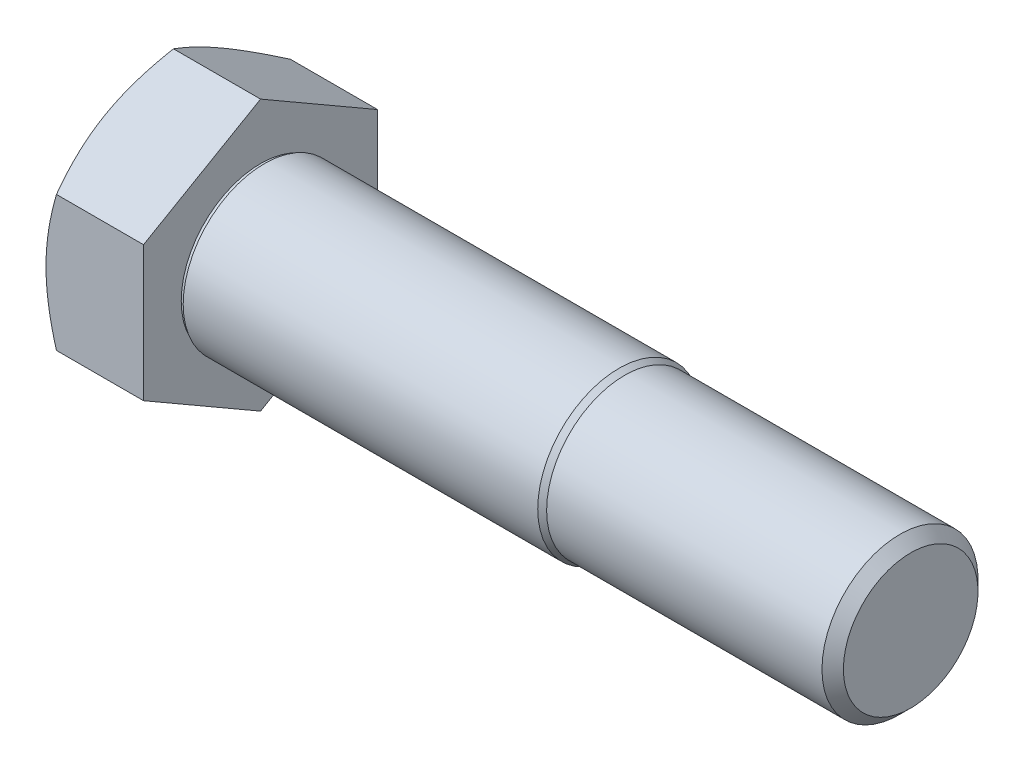
ISO-10303-21;
HEADER;
FILE_DESCRIPTION(('STEP AP214'),'2;1');
FILE_NAME('part.step','',(''),(''),'','','');
FILE_SCHEMA(('AUTOMOTIVE_DESIGN { 1 0 10303 214 1 1 1 1 }'));
ENDSEC;
DATA;
#1=APPLICATION_CONTEXT('core data for automotive mechanical design processes');
#2=APPLICATION_PROTOCOL_DEFINITION('international standard','automotive_design',2000,#1);
#3=PRODUCT_CONTEXT('',#1,'mechanical');
#4=PRODUCT('Part','Part','',(#3));
#5=PRODUCT_RELATED_PRODUCT_CATEGORY('part','',(#4));
#6=PRODUCT_DEFINITION_FORMATION('','',#4);
#7=PRODUCT_DEFINITION_CONTEXT('part definition',#1,'design');
#8=PRODUCT_DEFINITION('design','',#6,#7);
#9=PRODUCT_DEFINITION_SHAPE('','',#8);
#10=(LENGTH_UNIT() NAMED_UNIT(*) SI_UNIT(.MILLI.,.METRE.));
#11=(NAMED_UNIT(*) PLANE_ANGLE_UNIT() SI_UNIT($,.RADIAN.));
#12=(NAMED_UNIT(*) SI_UNIT($,.STERADIAN.) SOLID_ANGLE_UNIT());
#13=UNCERTAINTY_MEASURE_WITH_UNIT(LENGTH_MEASURE(1.E-05),#10,'distance_accuracy_value','');
#14=(GEOMETRIC_REPRESENTATION_CONTEXT(3) GLOBAL_UNCERTAINTY_ASSIGNED_CONTEXT((#13)) GLOBAL_UNIT_ASSIGNED_CONTEXT((#10,
#11,#12)) REPRESENTATION_CONTEXT('',''));
#15=CARTESIAN_POINT('',(0.,0.,0.));
#16=DIRECTION('',(0.,0.,1.));
#17=DIRECTION('',(1.,0.,0.));
#18=AXIS2_PLACEMENT_3D('',#15,#16,#17);
#19=CARTESIAN_POINT('',(-5.61194554994622,36.3424917997065,25.367225787412));
#20=DIRECTION('',(1.,0.,0.));
#21=DIRECTION('',(0.,0.,-1.));
#22=AXIS2_PLACEMENT_3D('',#19,#20,#21);
#23=PLANE('',#22);
#24=DIRECTION('',(0.,0.5,0.866025403784439));
#25=VECTOR('',#24,1.);
#26=CARTESIAN_POINT('',(-5.61194554994622,15.55788210888,-10.632774212588));
#27=LINE('',#26,#25);
#28=CARTESIAN_POINT('',(-5.61194554994622,15.55788210888,-10.632774212588));
#29=VERTEX_POINT('',#28);
#30=CARTESIAN_POINT('',(-5.61194554994622,25.9501869542932,7.367225787412));
#31=VERTEX_POINT('',#30);
#32=EDGE_CURVE('E156',#29,#31,#27,.T.);
#33=ORIENTED_EDGE('',*,*,#32,.T.);
#34=DIRECTION('',(0.,-0.5,0.866025403784439));
#35=VECTOR('',#34,1.);
#36=CARTESIAN_POINT('',(-5.61194554994622,25.9501869542932,7.367225787412));
#37=LINE('',#36,#35);
#38=CARTESIAN_POINT('',(-5.61194554994622,15.55788210888,25.367225787412));
#39=VERTEX_POINT('',#38);
#40=EDGE_CURVE('E154',#31,#39,#37,.T.);
#41=ORIENTED_EDGE('',*,*,#40,.T.);
#42=DIRECTION('',(0.,-1.,0.));
#43=VECTOR('',#42,1.);
#44=CARTESIAN_POINT('',(-5.61194554994622,15.55788210888,25.367225787412));
#45=LINE('',#44,#43);
#46=CARTESIAN_POINT('',(-5.61194554994622,-5.22672758194655,25.367225787412));
#47=VERTEX_POINT('',#46);
#48=EDGE_CURVE('E131',#39,#47,#45,.T.);
#49=ORIENTED_EDGE('',*,*,#48,.T.);
#50=DIRECTION('',(0.,-0.5,-0.866025403784438));
#51=VECTOR('',#50,1.);
#52=CARTESIAN_POINT('',(-5.61194554994622,-5.22672758194655,25.367225787412));
#53=LINE('',#52,#51);
#54=CARTESIAN_POINT('',(-5.61194554994622,-15.6190324273598,7.36722578741201));
#55=VERTEX_POINT('',#54);
#56=EDGE_CURVE('E151',#47,#55,#53,.T.);
#57=ORIENTED_EDGE('',*,*,#56,.T.);
#58=DIRECTION('',(0.,0.5,-0.866025403784439));
#59=VECTOR('',#58,1.);
#60=CARTESIAN_POINT('',(-5.61194554994622,-15.6190324273598,7.36722578741201));
#61=LINE('',#60,#59);
#62=CARTESIAN_POINT('',(-5.61194554994622,-5.22672758194656,-10.632774212588));
#63=VERTEX_POINT('',#62);
#64=EDGE_CURVE('E149',#55,#63,#61,.T.);
#65=ORIENTED_EDGE('',*,*,#64,.T.);
#66=DIRECTION('',(0.,1.,0.));
#67=VECTOR('',#66,1.);
#68=CARTESIAN_POINT('',(-5.61194554994622,-5.22672758194656,-10.632774212588));
#69=LINE('',#68,#67);
#70=EDGE_CURVE('E147',#63,#29,#69,.T.);
#71=ORIENTED_EDGE('',*,*,#70,.T.);
#72=EDGE_LOOP('',(#33,#41,#49,#57,#65,#71));
#73=FACE_BOUND('',#72,.T.);
#74=CARTESIAN_POINT('',(-5.61194554994622,5.16557726346671,7.367225787412));
#75=DIRECTION('',(-1.,0.,0.));
#76=DIRECTION('',(0.,0.,1.));
#77=AXIS2_PLACEMENT_3D('',#74,#75,#76);
#78=CIRCLE('',#77,12.2);
#79=CARTESIAN_POINT('',(-5.61194554994622,5.16557726346671,19.567225787412));
#80=VERTEX_POINT('',#79);
#81=EDGE_CURVE('E249',#80,#80,#78,.T.);
#82=ORIENTED_EDGE('',*,*,#81,.T.);
#83=EDGE_LOOP('',(#82));
#84=FACE_BOUND('',#83,.T.);
#85=ADVANCED_FACE('F38',(#73,#84),#23,.T.);
#86=CARTESIAN_POINT('',(-5.61194554994622,15.55788210888,-10.632774212588));
#87=DIRECTION('',(0.,-0.866025403784439,0.5));
#88=DIRECTION('',(0.,-0.5,-0.866025403784439));
#89=AXIS2_PLACEMENT_3D('',#86,#87,#88);
#90=PLANE('',#89);
#91=CARTESIAN_POINT('',(-19.0041837281373,25.9503024243471,7.367425787412));
#92=CARTESIAN_POINT('',(-19.1360521843831,25.721883843052,6.97179319921611));
#93=CARTESIAN_POINT('',(-19.2619366597344,25.4925743066896,6.57461743157644));
#94=CARTESIAN_POINT('',(-19.5000743138352,25.0321164436975,5.77708101812953));
#95=CARTESIAN_POINT('',(-19.6123230092869,24.800967538776,5.37671937069149));
#96=CARTESIAN_POINT('',(-19.8216802523623,24.336384200377,4.57203742423445));
#97=CARTESIAN_POINT('',(-19.9187529768052,24.1029457013472,4.16771008347221));
#98=CARTESIAN_POINT('',(-20.0956738061586,23.6344466473242,3.35624591860653));
#99=CARTESIAN_POINT('',(-20.1755228975255,23.3993861860226,2.94910925678158));
#100=CARTESIAN_POINT('',(-20.3146002470914,22.9336662512624,2.14245866767916));
#101=CARTESIAN_POINT('',(-20.3742888268326,22.7030413527097,1.74300462589558));
#102=CARTESIAN_POINT('',(-20.4743731742768,22.2407347994414,0.942266186962716));
#103=CARTESIAN_POINT('',(-20.5147685706211,22.0090531244713,0.54098175473183));
#104=CARTESIAN_POINT('',(-20.5752465911287,21.5453005919458,-0.262261193740945));
#105=CARTESIAN_POINT('',(-20.5953533529074,21.3132305266549,-0.664218337740617));
#106=CARTESIAN_POINT('',(-20.6148216959488,20.8488761876921,-1.46850364553937));
#107=CARTESIAN_POINT('',(-20.6141839182373,20.6165919208609,-1.87083179748978));
#108=CARTESIAN_POINT('',(-20.5936119704498,20.1823311283239,-2.6229935538991));
#109=CARTESIAN_POINT('',(-20.5761863655456,19.9803236615543,-2.97288074985222));
#110=CARTESIAN_POINT('',(-20.525976481445,19.5767905935615,-3.67182052614991));
#111=CARTESIAN_POINT('',(-20.49319242221,19.3752649854787,-4.02087311837557));
#112=CARTESIAN_POINT('',(-20.4128344923675,18.9727719875026,-4.71801144056083));
#113=CARTESIAN_POINT('',(-20.3652472473814,18.7718052688824,-5.06609600784153));
#114=CARTESIAN_POINT('',(-20.2561226733788,18.3708285197288,-5.76060811002932));
#115=CARTESIAN_POINT('',(-20.1945854034736,18.1708184851453,-6.10703565195148));
#116=CARTESIAN_POINT('',(-19.9874834742377,17.5636622331359,-7.158661128565));
#117=CARTESIAN_POINT('',(-19.8212680820131,17.1582742781367,-7.86081366339998));
#118=CARTESIAN_POINT('',(-19.4440273796474,16.3535431138373,-9.25464892640057));
#119=CARTESIAN_POINT('',(-19.2330906628185,15.9541896016968,-9.94634949960911));
#120=CARTESIAN_POINT('',(-19.0041837281373,15.5577666388261,-10.632974212588));
#121=B_SPLINE_CURVE_WITH_KNOTS('',3,(#91,#92,#93,#94,#95,#96,#97,#98,#99,#100,#101,#102,#103,
#104,#105,#106,#107,#108,#109,#110,#111,#112,#113,#114,#115,#116,#117,#118,#119,#120),
.UNSPECIFIED.,.F.,.F.,(4,2,2,2,2,2,2,2,2,2,2,2,2,2,4),(0.,1.42650335783821,2.85347447244912,
4.28376471280637,5.71397301377358,7.10888071673007,8.50381526803679,9.89708828642548,
11.2903182514067,12.5031974791544,13.7160593367767,14.9300201888636,16.1439758970578,
18.6253607678546,21.1018751738864),.UNSPECIFIED.);
#122=CARTESIAN_POINT('',(-19.0042503953595,25.9501869542932,7.367225787412));
#123=VERTEX_POINT('',#122);
#124=CARTESIAN_POINT('',(-20.6119455499462,20.7540345315866,-1.632774212588));
#125=VERTEX_POINT('',#124);
#126=EDGE_CURVE('E55',#123,#125,#121,.T.);
#127=ORIENTED_EDGE('',*,*,#126,.F.);
#128=DIRECTION('',(-1.,0.,0.));
#129=VECTOR('',#128,1.);
#130=CARTESIAN_POINT('',(-5.61194554994622,25.9501869542932,7.367225787412));
#131=LINE('',#130,#129);
#132=EDGE_CURVE('E132',#31,#123,#131,.T.);
#133=ORIENTED_EDGE('',*,*,#132,.F.);
#134=ORIENTED_EDGE('',*,*,#32,.F.);
#135=DIRECTION('',(-1.,0.,0.));
#136=VECTOR('',#135,1.);
#137=CARTESIAN_POINT('',(-5.61194554994622,15.55788210888,-10.632774212588));
#138=LINE('',#137,#136);
#139=CARTESIAN_POINT('',(-19.0042503953595,15.55788210888,-10.632774212588));
#140=VERTEX_POINT('',#139);
#141=EDGE_CURVE('E144',#29,#140,#138,.T.);
#142=ORIENTED_EDGE('',*,*,#141,.T.);
#143=EDGE_CURVE('E203',#125,#140,#121,.T.);
#144=ORIENTED_EDGE('',*,*,#143,.F.);
#145=EDGE_LOOP('',(#127,#133,#134,#142,#144));
#146=FACE_BOUND('',#145,.T.);
#147=ADVANCED_FACE('F40',(#146),#90,.F.);
#148=CARTESIAN_POINT('',(-5.61194554994622,25.9501869542932,7.367225787412));
#149=DIRECTION('',(0.,-0.866025403784439,-0.5));
#150=DIRECTION('',(0.,0.5,-0.866025403784439));
#151=AXIS2_PLACEMENT_3D('',#148,#149,#150);
#152=PLANE('',#151);
#153=CARTESIAN_POINT('',(-19.0041837281373,15.5577666388261,25.367425787412));
#154=CARTESIAN_POINT('',(-19.1360521843831,15.7861852201212,24.9717931992161));
#155=CARTESIAN_POINT('',(-19.2619366597344,16.0154947564836,24.5746174315764));
#156=CARTESIAN_POINT('',(-19.5000743138352,16.4759526194757,23.7770810181295));
#157=CARTESIAN_POINT('',(-19.6123230092869,16.7071015243972,23.3767193706915));
#158=CARTESIAN_POINT('',(-19.8216802523623,17.1716848627962,22.5720374242345));
#159=CARTESIAN_POINT('',(-19.9187529768052,17.405123361826,22.1677100834722));
#160=CARTESIAN_POINT('',(-20.0956738061586,17.873622415849,21.3562459186065));
#161=CARTESIAN_POINT('',(-20.1755228975255,18.1086828771506,20.9491092567816));
#162=CARTESIAN_POINT('',(-20.3146002470914,18.5744028119108,20.1424586676792));
#163=CARTESIAN_POINT('',(-20.3742888268326,18.8050277104635,19.7430046258956));
#164=CARTESIAN_POINT('',(-20.4743731742768,19.2673342637318,18.9422661869627));
#165=CARTESIAN_POINT('',(-20.5147685706211,19.499015938702,18.5409817547318));
#166=CARTESIAN_POINT('',(-20.5752465911287,19.9627684712274,17.7377388062591));
#167=CARTESIAN_POINT('',(-20.5953533529074,20.1948385365183,17.3357816622594));
#168=CARTESIAN_POINT('',(-20.6148216959488,20.6591928754811,16.5314963544606));
#169=CARTESIAN_POINT('',(-20.6141839182373,20.8914771423123,16.1291682025102));
#170=CARTESIAN_POINT('',(-20.5936119704498,21.3257379348493,15.3770064461009));
#171=CARTESIAN_POINT('',(-20.5761863655456,21.5277454016189,15.0271192501478));
#172=CARTESIAN_POINT('',(-20.525976481445,21.9312784696117,14.3281794738501));
#173=CARTESIAN_POINT('',(-20.49319242221,22.1328040776945,13.9791268816244));
#174=CARTESIAN_POINT('',(-20.4128344923675,22.5352970756706,13.2819885594392));
#175=CARTESIAN_POINT('',(-20.3652472473814,22.7362637942908,12.9339039921585));
#176=CARTESIAN_POINT('',(-20.2561226733788,23.1372405434444,12.2393918899707));
#177=CARTESIAN_POINT('',(-20.1945854034736,23.3372505780279,11.8929643480485));
#178=CARTESIAN_POINT('',(-19.9874834742377,23.9444068300374,10.841338871435));
#179=CARTESIAN_POINT('',(-19.8212680820131,24.3497947850365,10.1391863366));
#180=CARTESIAN_POINT('',(-19.4440273796474,25.1545259493359,8.74535107359942));
#181=CARTESIAN_POINT('',(-19.2330906628185,25.5538794614765,8.05365050039088));
#182=CARTESIAN_POINT('',(-19.0041837281373,25.9503024243471,7.367025787412));
#183=B_SPLINE_CURVE_WITH_KNOTS('',3,(#153,#154,#155,#156,#157,#158,#159,#160,#161,#162,#163,
#164,#165,#166,#167,#168,#169,#170,#171,#172,#173,#174,#175,#176,#177,#178,#179,#180,#181,#182),
.UNSPECIFIED.,.F.,.F.,(4,2,2,2,2,2,2,2,2,2,2,2,2,2,4),(0.,1.42650335783821,2.85347447244912,
4.28376471280637,5.71397301377358,7.10888071673008,8.5038152680368,9.89708828642549,
11.2903182514067,12.5031974791544,13.7160593367767,14.9300201888636,16.1439758970578,
18.6253607678546,21.1018751738864),.UNSPECIFIED.);
#184=CARTESIAN_POINT('',(-19.0042503953595,15.55788210888,25.367225787412));
#185=VERTEX_POINT('',#184);
#186=CARTESIAN_POINT('',(-20.6119455499462,20.7540345315866,16.367225787412));
#187=VERTEX_POINT('',#186);
#188=EDGE_CURVE('E62',#185,#187,#183,.T.);
#189=ORIENTED_EDGE('',*,*,#188,.F.);
#190=DIRECTION('',(-1.,0.,0.));
#191=VECTOR('',#190,1.);
#192=CARTESIAN_POINT('',(-5.61194554994622,15.55788210888,25.367225787412));
#193=LINE('',#192,#191);
#194=EDGE_CURVE('E124',#39,#185,#193,.T.);
#195=ORIENTED_EDGE('',*,*,#194,.F.);
#196=ORIENTED_EDGE('',*,*,#40,.F.);
#197=ORIENTED_EDGE('',*,*,#132,.T.);
#198=EDGE_CURVE('E127',#187,#123,#183,.T.);
#199=ORIENTED_EDGE('',*,*,#198,.F.);
#200=EDGE_LOOP('',(#189,#195,#196,#197,#199));
#201=FACE_BOUND('',#200,.T.);
#202=ADVANCED_FACE('F123',(#201),#152,.F.);
#203=CARTESIAN_POINT('',(-5.61194554994622,15.55788210888,25.367225787412));
#204=DIRECTION('',(0.,0.,-1.));
#205=DIRECTION('',(0.,1.,0.));
#206=AXIS2_PLACEMENT_3D('',#203,#204,#205);
#207=PLANE('',#206);
#208=CARTESIAN_POINT('',(-11.9984648543637,-22.3963466913481,25.367225787412));
#209=CARTESIAN_POINT('',(-12.18946784507,-22.0012104680391,25.367225787412));
#210=CARTESIAN_POINT('',(-12.3794823110363,-21.6055966426515,25.367225787412));
#211=CARTESIAN_POINT('',(-12.7573072909133,-20.8133128869273,25.367225787412));
#212=CARTESIAN_POINT('',(-12.9451177806072,-20.4166429450448,25.367225787412));
#213=CARTESIAN_POINT('',(-13.5049573359624,-19.2247814473515,25.367225787412));
#214=CARTESIAN_POINT('',(-13.8733322306512,-18.4278666425716,25.367225787412));
#215=CARTESIAN_POINT('',(-14.6000672287883,-16.8239698784672,25.367225787412));
#216=CARTESIAN_POINT('',(-14.9583579580317,-16.0169564063326,25.367225787412));
#217=CARTESIAN_POINT('',(-15.6595561007202,-14.3962973475724,25.367225787412));
#218=CARTESIAN_POINT('',(-16.0024643153907,-13.5826521089887,25.367225787412));
#219=CARTESIAN_POINT('',(-16.672868080097,-11.9373350467016,25.367225787412));
#220=CARTESIAN_POINT('',(-17.0001227257272,-11.1055645469376,25.367225787412));
#221=CARTESIAN_POINT('',(-17.6290026257973,-9.4322070227103,25.367225787412));
#222=CARTESIAN_POINT('',(-17.9306250316413,-8.59061891897299,25.367225787412));
#223=CARTESIAN_POINT('',(-18.500131872749,-6.89804353272565,25.367225787412));
#224=CARTESIAN_POINT('',(-18.7680880383487,-6.04708058494092,25.367225787412));
#225=CARTESIAN_POINT('',(-19.2615733398929,-4.33297487608337,25.367225787412));
#226=CARTESIAN_POINT('',(-19.4871158790999,-3.46983605575098,25.367225787412));
#227=CARTESIAN_POINT('',(-19.7853630006805,-2.16583189823723,25.367225787412));
#228=CARTESIAN_POINT('',(-19.878116190292,-1.72952194689036,25.367225787412));
#229=CARTESIAN_POINT('',(-20.0488023742977,-0.853998157344695,25.367225787412));
#230=CARTESIAN_POINT('',(-20.1267357015211,-0.414784384590179,25.367225787412));
#231=CARTESIAN_POINT('',(-20.2664005139497,0.466252271205412,25.367225787412));
#232=CARTESIAN_POINT('',(-20.3281310040866,0.908075312787082,25.367225787412));
#233=CARTESIAN_POINT('',(-20.4341502679296,1.79382423671469,25.367225787412));
#234=CARTESIAN_POINT('',(-20.4784390209059,2.23775012155924,25.367225787412));
#235=CARTESIAN_POINT('',(-20.5483825042872,3.12423922342469,25.367225787412));
#236=CARTESIAN_POINT('',(-20.5741538270909,3.56679318083471,25.367225787412));
#237=CARTESIAN_POINT('',(-20.6069269655557,4.4525933368334,25.367225787412));
#238=CARTESIAN_POINT('',(-20.6139290648137,4.89583952486142,25.367225787412));
#239=CARTESIAN_POINT('',(-20.6089976903522,5.78210599161337,25.367225787412));
#240=CARTESIAN_POINT('',(-20.597069454749,6.22512629891102,25.367225787412));
#241=CARTESIAN_POINT('',(-20.5545740093107,7.11027399758292,25.367225787412));
#242=CARTESIAN_POINT('',(-20.5240059789769,7.55240134879082,25.367225787412));
#243=CARTESIAN_POINT('',(-20.4279958506362,8.62365837003654,25.367225787412));
#244=CARTESIAN_POINT('',(-20.3532333736594,9.25196899728368,25.367225787412));
#245=CARTESIAN_POINT('',(-20.1702270968932,10.5036681578543,25.367225787412));
#246=CARTESIAN_POINT('',(-20.0619783299656,11.1270559468781,25.367225787412));
#247=CARTESIAN_POINT('',(-19.6924320192404,12.9909226069994,25.367225787412));
#248=CARTESIAN_POINT('',(-19.3865804764281,14.2226699754074,25.367225787412));
#249=CARTESIAN_POINT('',(-18.8591911048339,16.0651582554042,25.367225787412));
#250=CARTESIAN_POINT('',(-18.6693785564117,16.685525725334,25.367225787412));
#251=CARTESIAN_POINT('',(-18.2708283555597,17.9202672950059,25.367225787412));
#252=CARTESIAN_POINT('',(-18.06208899474,18.5346408481646,25.367225787412));
#253=CARTESIAN_POINT('',(-17.6301328805666,19.7543321687252,25.367225787412));
#254=CARTESIAN_POINT('',(-17.4070044097444,20.3596814665342,25.367225787412));
#255=CARTESIAN_POINT('',(-17.062651181119,21.2638928885656,25.367225787412));
#256=CARTESIAN_POINT('',(-16.9462763931673,21.5646126848273,25.367225787412));
#257=CARTESIAN_POINT('',(-16.7105679897717,22.1648840643901,25.367225787412));
#258=CARTESIAN_POINT('',(-16.5912344329859,22.4644356707148,25.367225787412));
#259=CARTESIAN_POINT('',(-16.4705550205082,22.7634437178675,25.367225787412));
#260=B_SPLINE_CURVE_WITH_KNOTS('',3,(#208,#209,#210,#211,#212,#213,#214,#215,#216,#217,#218,
#219,#220,#221,#222,#223,#224,#225,#226,#227,#228,#229,#230,#231,#232,#233,#234,#235,#236,#237,
#238,#239,#240,#241,#242,#243,#244,#245,#246,#247,#248,#249,#250,#251,#252,#253,#254,#255,#256,
#257,#258,#259),.UNSPECIFIED.,.F.,.F.,(4,2,2,2,2,2,2,2,2,2,2,2,2,2,2,2,2,2,2,2,2,2,2,2,2,4),(0.,
1.3166344390565,2.6332833315075,5.26700924472548,7.91580691121445,10.5644664498451,
13.2456434009398,15.9271179315146,18.6027786855858,21.2775924696093,22.6155612790714,
23.9535000364353,25.2915209416894,26.6295434371915,27.9590656257616,29.2885677255707,
30.6177020097832,31.9468948049265,33.8440459909246,35.7414787230295,39.5436531019888,
41.4897689730644,43.4360606814942,45.3713764468859,46.3387197810933,47.3060439528869),.UNSPECIFIED.);
#261=CARTESIAN_POINT('',(-19.0042503953595,-5.22672758194655,25.367225787412));
#262=VERTEX_POINT('',#261);
#263=CARTESIAN_POINT('',(-20.6119455499462,5.16557726346671,25.367225787412));
#264=VERTEX_POINT('',#263);
#265=EDGE_CURVE('E117',#262,#264,#260,.T.);
#266=ORIENTED_EDGE('',*,*,#265,.F.);
#267=DIRECTION('',(-1.,0.,0.));
#268=VECTOR('',#267,1.);
#269=CARTESIAN_POINT('',(-5.61194554994622,-5.22672758194655,25.367225787412));
#270=LINE('',#269,#268);
#271=EDGE_CURVE('E133',#47,#262,#270,.T.);
#272=ORIENTED_EDGE('',*,*,#271,.F.);
#273=ORIENTED_EDGE('',*,*,#48,.F.);
#274=ORIENTED_EDGE('',*,*,#194,.T.);
#275=EDGE_CURVE('E109',#264,#185,#260,.T.);
#276=ORIENTED_EDGE('',*,*,#275,.F.);
#277=EDGE_LOOP('',(#266,#272,#273,#274,#276));
#278=FACE_BOUND('',#277,.T.);
#279=ADVANCED_FACE('F129',(#278),#207,.F.);
#280=CARTESIAN_POINT('',(-5.61194554994622,-5.22672758194655,25.367225787412));
#281=DIRECTION('',(0.,0.866025403784438,-0.5));
#282=DIRECTION('',(0.,0.5,0.866025403784439));
#283=AXIS2_PLACEMENT_3D('',#280,#281,#282);
#284=PLANE('',#283);
#285=CARTESIAN_POINT('',(-19.0041837281373,-15.6191478974137,7.36702578741201));
#286=CARTESIAN_POINT('',(-19.1360521843831,-15.3907293161186,7.76265837560789));
#287=CARTESIAN_POINT('',(-19.2619366597344,-15.1614197797562,8.15983414324756));
#288=CARTESIAN_POINT('',(-19.5000743138352,-14.7009619167641,8.95737055669447));
#289=CARTESIAN_POINT('',(-19.6123230092869,-14.4698130118426,9.35773220413252));
#290=CARTESIAN_POINT('',(-19.8216802523623,-14.0052296734436,10.1624141505895));
#291=CARTESIAN_POINT('',(-19.9187529768052,-13.7717911744137,10.5667414913518));
#292=CARTESIAN_POINT('',(-20.0956738061586,-13.3032921203908,11.3782056562175));
#293=CARTESIAN_POINT('',(-20.1755228975255,-13.0682316590892,11.7853423180424));
#294=CARTESIAN_POINT('',(-20.3146002470914,-12.602511724329,12.5919929071448));
#295=CARTESIAN_POINT('',(-20.3742888268326,-12.3718868257763,12.9914469489284));
#296=CARTESIAN_POINT('',(-20.4743731742768,-11.909580272508,13.7921853878613));
#297=CARTESIAN_POINT('',(-20.5147685706211,-11.6778985975378,14.1934698200922));
#298=CARTESIAN_POINT('',(-20.5752465911287,-11.2141460650124,14.9967127685649));
#299=CARTESIAN_POINT('',(-20.5953533529074,-10.9820759997215,15.3986699125646));
#300=CARTESIAN_POINT('',(-20.6148216959488,-10.5177216607586,16.2029552203634));
#301=CARTESIAN_POINT('',(-20.6141839182373,-10.2854373939275,16.6052833723138));
#302=CARTESIAN_POINT('',(-20.5936119704498,-9.85117660139045,17.3574451287231));
#303=CARTESIAN_POINT('',(-20.5761863655456,-9.64916913462091,17.7073323246762));
#304=CARTESIAN_POINT('',(-20.525976481445,-9.2456360666281,18.4062721009739));
#305=CARTESIAN_POINT('',(-20.49319242221,-9.04411045854528,18.7553246931996));
#306=CARTESIAN_POINT('',(-20.4128344923675,-8.64161746056921,19.4524630153848));
#307=CARTESIAN_POINT('',(-20.3652472473814,-8.44065074194895,19.8005475826655));
#308=CARTESIAN_POINT('',(-20.2561226733788,-8.03967399279537,20.4950596848533));
#309=CARTESIAN_POINT('',(-20.1945854034736,-7.83966395821191,20.8414872267755));
#310=CARTESIAN_POINT('',(-19.9874834742377,-7.23250770620242,21.893112703389));
#311=CARTESIAN_POINT('',(-19.8212680820131,-6.82711975120327,22.595265238224));
#312=CARTESIAN_POINT('',(-19.4440273796474,-6.02238858690389,23.9891005012246));
#313=CARTESIAN_POINT('',(-19.2330906628185,-5.62303507476332,24.6808010744331));
#314=CARTESIAN_POINT('',(-19.0041837281373,-5.22661211189271,25.367425787412));
#315=B_SPLINE_CURVE_WITH_KNOTS('',3,(#285,#286,#287,#288,#289,#290,#291,#292,#293,#294,#295,
#296,#297,#298,#299,#300,#301,#302,#303,#304,#305,#306,#307,#308,#309,#310,#311,#312,#313,#314),
.UNSPECIFIED.,.F.,.F.,(4,2,2,2,2,2,2,2,2,2,2,2,2,2,4),(0.,1.42650335783821,2.85347447244912,
4.28376471280637,5.71397301377358,7.10888071673007,8.50381526803679,9.89708828642549,
11.2903182514067,12.5031974791544,13.7160593367767,14.9300201888636,16.1439758970578,
18.6253607678546,21.1018751738864),.UNSPECIFIED.);
#316=CARTESIAN_POINT('',(-19.0042503953595,-15.6190324273598,7.36722578741201));
#317=VERTEX_POINT('',#316);
#318=CARTESIAN_POINT('',(-20.6119455499462,-10.4228800046532,16.367225787412));
#319=VERTEX_POINT('',#318);
#320=EDGE_CURVE('E208',#317,#319,#315,.T.);
#321=ORIENTED_EDGE('',*,*,#320,.F.);
#322=DIRECTION('',(-1.,0.,0.));
#323=VECTOR('',#322,1.);
#324=CARTESIAN_POINT('',(-5.61194554994622,-15.6190324273598,7.36722578741201));
#325=LINE('',#324,#323);
#326=EDGE_CURVE('E136',#55,#317,#325,.T.);
#327=ORIENTED_EDGE('',*,*,#326,.F.);
#328=ORIENTED_EDGE('',*,*,#56,.F.);
#329=ORIENTED_EDGE('',*,*,#271,.T.);
#330=EDGE_CURVE('E118',#319,#262,#315,.T.);
#331=ORIENTED_EDGE('',*,*,#330,.F.);
#332=EDGE_LOOP('',(#321,#327,#328,#329,#331));
#333=FACE_BOUND('',#332,.T.);
#334=ADVANCED_FACE('F214',(#333),#284,.F.);
#335=CARTESIAN_POINT('',(-5.61194554994622,-15.6190324273598,7.36722578741201));
#336=DIRECTION('',(0.,0.866025403784439,0.5));
#337=DIRECTION('',(0.,-0.5,0.866025403784439));
#338=AXIS2_PLACEMENT_3D('',#335,#336,#337);
#339=PLANE('',#338);
#340=CARTESIAN_POINT('',(-19.0041837281373,-5.22661211189272,-10.632974212588));
#341=CARTESIAN_POINT('',(-19.1360521843831,-5.45503069318781,-10.2373416243921));
#342=CARTESIAN_POINT('',(-19.2619366597344,-5.68434022955017,-9.84016585675244));
#343=CARTESIAN_POINT('',(-19.5000743138352,-6.14479809254227,-9.04262944330553));
#344=CARTESIAN_POINT('',(-19.6123230092869,-6.37594699746383,-8.64226779586749));
#345=CARTESIAN_POINT('',(-19.8216802523623,-6.84053033586283,-7.83758584941045));
#346=CARTESIAN_POINT('',(-19.9187529768052,-7.07396883489263,-7.43325850864821));
#347=CARTESIAN_POINT('',(-20.0956738061586,-7.54246788891557,-6.62179434378253));
#348=CARTESIAN_POINT('',(-20.1755228975255,-7.77752835021717,-6.21465768195757));
#349=CARTESIAN_POINT('',(-20.3146002470914,-8.24324828497742,-5.40800709285516));
#350=CARTESIAN_POINT('',(-20.3742888268326,-8.47387318353005,-5.00855305107157));
#351=CARTESIAN_POINT('',(-20.4743731742768,-8.93617973679842,-4.20781461213871));
#352=CARTESIAN_POINT('',(-20.5147685706211,-9.16786141176853,-3.80653017990782));
#353=CARTESIAN_POINT('',(-20.5752465911287,-9.63161394429396,-3.00328723143505));
#354=CARTESIAN_POINT('',(-20.5953533529074,-9.86368400958486,-2.60133008743537));
#355=CARTESIAN_POINT('',(-20.6148216959488,-10.3280383485477,-1.79704477963663));
#356=CARTESIAN_POINT('',(-20.6141839182373,-10.5603226153789,-1.39471662768621));
#357=CARTESIAN_POINT('',(-20.5936119704498,-10.9945834079159,-0.642554871276892));
#358=CARTESIAN_POINT('',(-20.5761863655456,-11.1965908746855,-0.292667675323773));
#359=CARTESIAN_POINT('',(-20.525976481445,-11.6001239426783,0.406272100973913));
#360=CARTESIAN_POINT('',(-20.49319242221,-11.8016495507611,0.75532469319958));
#361=CARTESIAN_POINT('',(-20.4128344923675,-12.2041425487372,1.45246301538484));
#362=CARTESIAN_POINT('',(-20.3652472473814,-12.4051092673574,1.80054758266554));
#363=CARTESIAN_POINT('',(-20.2561226733788,-12.806086016511,2.49505968485333));
#364=CARTESIAN_POINT('',(-20.1945854034736,-13.0060960510945,2.84148722677549));
#365=CARTESIAN_POINT('',(-19.9874834742377,-13.6132523031039,3.89311270338901));
#366=CARTESIAN_POINT('',(-19.8212680820131,-14.0186402581031,4.59526523822399));
#367=CARTESIAN_POINT('',(-19.4440273796474,-14.8233714224025,5.98910050122458));
#368=CARTESIAN_POINT('',(-19.2330906628185,-15.222724934543,6.68080107443312));
#369=CARTESIAN_POINT('',(-19.0041837281373,-15.6191478974137,7.36742578741201));
#370=B_SPLINE_CURVE_WITH_KNOTS('',3,(#340,#341,#342,#343,#344,#345,#346,#347,#348,#349,#350,
#351,#352,#353,#354,#355,#356,#357,#358,#359,#360,#361,#362,#363,#364,#365,#366,#367,#368,#369),
.UNSPECIFIED.,.F.,.F.,(4,2,2,2,2,2,2,2,2,2,2,2,2,2,4),(0.,1.42650335783821,2.85347447244912,
4.28376471280637,5.71397301377358,7.10888071673007,8.5038152680368,9.89708828642549,
11.2903182514067,12.5031974791544,13.7160593367767,14.9300201888636,16.1439758970578,
18.6253607678546,21.1018751738864),.UNSPECIFIED.);
#371=CARTESIAN_POINT('',(-19.0042503953595,-5.22672758194656,-10.632774212588));
#372=VERTEX_POINT('',#371);
#373=CARTESIAN_POINT('',(-20.6119455499462,-10.4228800046532,-1.63277421258799));
#374=VERTEX_POINT('',#373);
#375=EDGE_CURVE('E195',#372,#374,#370,.T.);
#376=ORIENTED_EDGE('',*,*,#375,.F.);
#377=DIRECTION('',(-1.,0.,0.));
#378=VECTOR('',#377,1.);
#379=CARTESIAN_POINT('',(-5.61194554994622,-5.22672758194656,-10.632774212588));
#380=LINE('',#379,#378);
#381=EDGE_CURVE('E141',#63,#372,#380,.T.);
#382=ORIENTED_EDGE('',*,*,#381,.F.);
#383=ORIENTED_EDGE('',*,*,#64,.F.);
#384=ORIENTED_EDGE('',*,*,#326,.T.);
#385=EDGE_CURVE('E213',#374,#317,#370,.T.);
#386=ORIENTED_EDGE('',*,*,#385,.F.);
#387=EDGE_LOOP('',(#376,#382,#383,#384,#386));
#388=FACE_BOUND('',#387,.T.);
#389=ADVANCED_FACE('F217',(#388),#339,.F.);
#390=CARTESIAN_POINT('',(-5.61194554994622,-5.22672758194656,-10.632774212588));
#391=DIRECTION('',(0.,0.,1.));
#392=DIRECTION('',(0.,-1.,0.));
#393=AXIS2_PLACEMENT_3D('',#390,#391,#392);
#394=PLANE('',#393);
#395=CARTESIAN_POINT('',(-11.9984648543637,-22.3963466913481,-10.632774212588));
#396=CARTESIAN_POINT('',(-12.18946784507,-22.0012104680391,-10.632774212588));
#397=CARTESIAN_POINT('',(-12.3794823110363,-21.6055966426515,-10.632774212588));
#398=CARTESIAN_POINT('',(-12.7573072909133,-20.8133128869273,-10.632774212588));
#399=CARTESIAN_POINT('',(-12.9451177806072,-20.4166429450448,-10.632774212588));
#400=CARTESIAN_POINT('',(-13.5049573359624,-19.2247814473515,-10.632774212588));
#401=CARTESIAN_POINT('',(-13.8733322306512,-18.4278666425716,-10.632774212588));
#402=CARTESIAN_POINT('',(-14.6000672287883,-16.8239698784672,-10.632774212588));
#403=CARTESIAN_POINT('',(-14.9583579580317,-16.0169564063326,-10.632774212588));
#404=CARTESIAN_POINT('',(-15.6595561007202,-14.3962973475724,-10.632774212588));
#405=CARTESIAN_POINT('',(-16.0024643153907,-13.5826521089887,-10.632774212588));
#406=CARTESIAN_POINT('',(-16.672868080097,-11.9373350467016,-10.632774212588));
#407=CARTESIAN_POINT('',(-17.0001227257272,-11.1055645469376,-10.632774212588));
#408=CARTESIAN_POINT('',(-17.6290026257973,-9.4322070227103,-10.632774212588));
#409=CARTESIAN_POINT('',(-17.9306250316413,-8.590618918973,-10.632774212588));
#410=CARTESIAN_POINT('',(-18.500131872749,-6.89804353272566,-10.632774212588));
#411=CARTESIAN_POINT('',(-18.7680880383487,-6.04708058494093,-10.632774212588));
#412=CARTESIAN_POINT('',(-19.261573339893,-4.33297487608338,-10.632774212588));
#413=CARTESIAN_POINT('',(-19.4871158790999,-3.46983605575099,-10.632774212588));
#414=CARTESIAN_POINT('',(-19.7853630006805,-2.16583189823724,-10.632774212588));
#415=CARTESIAN_POINT('',(-19.878116190292,-1.72952194689037,-10.632774212588));
#416=CARTESIAN_POINT('',(-20.0488023742977,-0.853998157344704,-10.632774212588));
#417=CARTESIAN_POINT('',(-20.1267357015211,-0.414784384590187,-10.632774212588));
#418=CARTESIAN_POINT('',(-20.2664005139497,0.466252271205404,-10.632774212588));
#419=CARTESIAN_POINT('',(-20.3281310040866,0.908075312787073,-10.632774212588));
#420=CARTESIAN_POINT('',(-20.4341502679296,1.79382423671468,-10.632774212588));
#421=CARTESIAN_POINT('',(-20.4784390209059,2.23775012155923,-10.632774212588));
#422=CARTESIAN_POINT('',(-20.5483825042872,3.12423922342468,-10.632774212588));
#423=CARTESIAN_POINT('',(-20.5741538270909,3.5667931808347,-10.632774212588));
#424=CARTESIAN_POINT('',(-20.6069269655558,4.45259333683338,-10.632774212588));
#425=CARTESIAN_POINT('',(-20.6139290648137,4.89583952486141,-10.632774212588));
#426=CARTESIAN_POINT('',(-20.6089976903522,5.78210599161335,-10.632774212588));
#427=CARTESIAN_POINT('',(-20.597069454749,6.22512629891101,-10.632774212588));
#428=CARTESIAN_POINT('',(-20.5545740093107,7.1102739975829,-10.632774212588));
#429=CARTESIAN_POINT('',(-20.5240059789769,7.55240134879081,-10.632774212588));
#430=CARTESIAN_POINT('',(-20.4279958506362,8.62365837003652,-10.632774212588));
#431=CARTESIAN_POINT('',(-20.3532333736594,9.25196899728366,-10.632774212588));
#432=CARTESIAN_POINT('',(-20.1702270968932,10.5036681578543,-10.632774212588));
#433=CARTESIAN_POINT('',(-20.0619783299656,11.1270559468781,-10.632774212588));
#434=CARTESIAN_POINT('',(-19.6924320192404,12.9909226069994,-10.632774212588));
#435=CARTESIAN_POINT('',(-19.3865804764281,14.2226699754073,-10.632774212588));
#436=CARTESIAN_POINT('',(-18.8591911048339,16.0651582554042,-10.632774212588));
#437=CARTESIAN_POINT('',(-18.6693785564118,16.685525725334,-10.632774212588));
#438=CARTESIAN_POINT('',(-18.2708283555597,17.9202672950058,-10.632774212588));
#439=CARTESIAN_POINT('',(-18.06208899474,18.5346408481645,-10.632774212588));
#440=CARTESIAN_POINT('',(-17.6301328805666,19.7543321687252,-10.632774212588));
#441=CARTESIAN_POINT('',(-17.4070044097444,20.3596814665341,-10.632774212588));
#442=CARTESIAN_POINT('',(-17.062651181119,21.2638928885656,-10.632774212588));
#443=CARTESIAN_POINT('',(-16.9462763931673,21.5646126848273,-10.632774212588));
#444=CARTESIAN_POINT('',(-16.7105679897717,22.1648840643901,-10.632774212588));
#445=CARTESIAN_POINT('',(-16.5912344329859,22.4644356707147,-10.632774212588));
#446=CARTESIAN_POINT('',(-16.4705550205082,22.7634437178675,-10.632774212588));
#447=B_SPLINE_CURVE_WITH_KNOTS('',3,(#395,#396,#397,#398,#399,#400,#401,#402,#403,#404,#405,
#406,#407,#408,#409,#410,#411,#412,#413,#414,#415,#416,#417,#418,#419,#420,#421,#422,#423,#424,
#425,#426,#427,#428,#429,#430,#431,#432,#433,#434,#435,#436,#437,#438,#439,#440,#441,#442,#443,
#444,#445,#446),.UNSPECIFIED.,.F.,.F.,(4,2,2,2,2,2,2,2,2,2,2,2,2,2,2,2,2,2,2,2,2,2,2,2,2,4),(0.,
1.3166344390565,2.6332833315075,5.26700924472548,7.91580691121445,10.5644664498451,
13.2456434009398,15.9271179315146,18.6027786855858,21.2775924696093,22.6155612790714,
23.9535000364353,25.2915209416894,26.6295434371915,27.9590656257616,29.2885677255707,
30.6177020097832,31.9468948049265,33.8440459909246,35.7414787230295,39.5436531019888,
41.4897689730643,43.4360606814942,45.3713764468858,46.3387197810933,47.3060439528869),.UNSPECIFIED.);
#448=CARTESIAN_POINT('',(-20.6119455499462,5.16557726346672,-10.632774212588));
#449=VERTEX_POINT('',#448);
#450=EDGE_CURVE('E271',#140,#449,#447,.F.);
#451=ORIENTED_EDGE('',*,*,#450,.F.);
#452=ORIENTED_EDGE('',*,*,#141,.F.);
#453=ORIENTED_EDGE('',*,*,#70,.F.);
#454=ORIENTED_EDGE('',*,*,#381,.T.);
#455=EDGE_CURVE('E185',#449,#372,#447,.F.);
#456=ORIENTED_EDGE('',*,*,#455,.F.);
#457=EDGE_LOOP('',(#451,#452,#453,#454,#456));
#458=FACE_BOUND('',#457,.T.);
#459=ADVANCED_FACE('F221',(#458),#394,.F.);
#460=CARTESIAN_POINT('',(-20.6119455499462,5.16557726346671,7.367225787412));
#461=DIRECTION('',(1.,0.,0.));
#462=DIRECTION('',(0.,0.,-1.));
#463=AXIS2_PLACEMENT_3D('',#460,#461,#462);
#464=CONICAL_SURFACE('',#463,18.,1.0471975511966);
#465=ORIENTED_EDGE('',*,*,#375,.T.);
#466=CARTESIAN_POINT('',(-20.6119455499462,5.16557726346671,7.367225787412));
#467=DIRECTION('',(1.,0.,0.));
#468=DIRECTION('',(0.,0.,-1.));
#469=AXIS2_PLACEMENT_3D('',#466,#467,#468);
#470=CIRCLE('',#469,18.);
#471=EDGE_CURVE('E43',#374,#449,#470,.T.);
#472=ORIENTED_EDGE('',*,*,#471,.T.);
#473=ORIENTED_EDGE('',*,*,#455,.T.);
#474=EDGE_LOOP('',(#465,#472,#473));
#475=FACE_BOUND('',#474,.T.);
#476=ADVANCED_FACE('F178',(#475),#464,.T.);
#477=ORIENTED_EDGE('',*,*,#320,.T.);
#478=EDGE_CURVE('E285',#319,#374,#470,.T.);
#479=ORIENTED_EDGE('',*,*,#478,.T.);
#480=ORIENTED_EDGE('',*,*,#385,.T.);
#481=EDGE_LOOP('',(#477,#479,#480));
#482=FACE_BOUND('',#481,.T.);
#483=ADVANCED_FACE('F176',(#482),#464,.T.);
#484=ORIENTED_EDGE('',*,*,#265,.T.);
#485=EDGE_CURVE('E293',#264,#319,#470,.T.);
#486=ORIENTED_EDGE('',*,*,#485,.T.);
#487=ORIENTED_EDGE('',*,*,#330,.T.);
#488=EDGE_LOOP('',(#484,#486,#487));
#489=FACE_BOUND('',#488,.T.);
#490=ADVANCED_FACE('F171',(#489),#464,.T.);
#491=ORIENTED_EDGE('',*,*,#275,.T.);
#492=ORIENTED_EDGE('',*,*,#188,.T.);
#493=CARTESIAN_POINT('',(-20.6119455499462,5.16557726346671,7.367225787412));
#494=DIRECTION('',(-1.,0.,0.));
#495=DIRECTION('',(0.,0.,1.));
#496=AXIS2_PLACEMENT_3D('',#493,#494,#495);
#497=CIRCLE('',#496,18.);
#498=EDGE_CURVE('E112',#264,#187,#497,.T.);
#499=ORIENTED_EDGE('',*,*,#498,.F.);
#500=EDGE_LOOP('',(#491,#492,#499));
#501=FACE_BOUND('',#500,.T.);
#502=ADVANCED_FACE('F110',(#501),#464,.T.);
#503=ORIENTED_EDGE('',*,*,#198,.T.);
#504=ORIENTED_EDGE('',*,*,#126,.T.);
#505=EDGE_CURVE('E48',#125,#187,#470,.T.);
#506=ORIENTED_EDGE('',*,*,#505,.T.);
#507=EDGE_LOOP('',(#503,#504,#506));
#508=FACE_BOUND('',#507,.T.);
#509=ADVANCED_FACE('F236',(#508),#464,.T.);
#510=ORIENTED_EDGE('',*,*,#143,.T.);
#511=ORIENTED_EDGE('',*,*,#450,.T.);
#512=EDGE_CURVE('E11',#449,#125,#470,.T.);
#513=ORIENTED_EDGE('',*,*,#512,.T.);
#514=EDGE_LOOP('',(#510,#511,#513));
#515=FACE_BOUND('',#514,.T.);
#516=ADVANCED_FACE('F228',(#515),#464,.T.);
#517=CARTESIAN_POINT('',(-20.6119455499462,36.3424917997065,25.367225787412));
#518=DIRECTION('',(1.,0.,0.));
#519=DIRECTION('',(0.,0.,-1.));
#520=AXIS2_PLACEMENT_3D('',#517,#518,#519);
#521=PLANE('',#520);
#522=ORIENTED_EDGE('',*,*,#512,.F.);
#523=ORIENTED_EDGE('',*,*,#471,.F.);
#524=ORIENTED_EDGE('',*,*,#478,.F.);
#525=ORIENTED_EDGE('',*,*,#485,.F.);
#526=ORIENTED_EDGE('',*,*,#498,.T.);
#527=ORIENTED_EDGE('',*,*,#505,.F.);
#528=EDGE_LOOP('',(#522,#523,#524,#525,#526,#527));
#529=FACE_BOUND('',#528,.T.);
#530=ADVANCED_FACE('F226',(#529),#521,.F.);
#531=CARTESIAN_POINT('',(94.3880544500538,15.5175772634667,7.367225787412));
#532=DIRECTION('',(-1.,0.,0.));
#533=DIRECTION('',(0.,0.,1.));
#534=AXIS2_PLACEMENT_3D('',#531,#532,#533);
#535=PLANE('',#534);
#536=CARTESIAN_POINT('',(94.3880544500538,5.16557726346671,7.367225787412));
#537=DIRECTION('',(-1.,0.,0.));
#538=DIRECTION('',(0.,0.,1.));
#539=AXIS2_PLACEMENT_3D('',#536,#537,#538);
#540=CIRCLE('',#539,10.352);
#541=CARTESIAN_POINT('',(94.3880544500538,5.16557726346671,17.719225787412));
#542=VERTEX_POINT('',#541);
#543=EDGE_CURVE('E268',#542,#542,#540,.T.);
#544=ORIENTED_EDGE('',*,*,#543,.F.);
#545=EDGE_LOOP('',(#544));
#546=FACE_BOUND('',#545,.T.);
#547=ADVANCED_FACE('F179',(#546),#535,.F.);
#548=CARTESIAN_POINT('',(94.3880544500538,5.16557726346671,7.367225787412));
#549=DIRECTION('',(-1.,0.,0.));
#550=DIRECTION('',(0.,0.,1.));
#551=AXIS2_PLACEMENT_3D('',#548,#549,#550);
#552=CONICAL_SURFACE('',#551,10.352,0.785398163397449);
#553=CARTESIAN_POINT('',(92.7400544500538,5.16557726346671,7.367225787412));
#554=DIRECTION('',(-1.,0.,0.));
#555=DIRECTION('',(0.,0.,1.));
#556=AXIS2_PLACEMENT_3D('',#553,#554,#555);
#557=CIRCLE('',#556,12.);
#558=CARTESIAN_POINT('',(92.7400544500538,5.16557726346671,19.367225787412));
#559=VERTEX_POINT('',#558);
#560=EDGE_CURVE('E265',#559,#559,#557,.T.);
#561=ORIENTED_EDGE('',*,*,#560,.F.);
#562=EDGE_LOOP('',(#561));
#563=FACE_BOUND('',#562,.T.);
#564=ORIENTED_EDGE('',*,*,#543,.T.);
#565=EDGE_LOOP('',(#564));
#566=FACE_BOUND('',#565,.T.);
#567=ADVANCED_FACE('F234',(#563,#566),#552,.T.);
#568=CARTESIAN_POINT('',(-20.6119455499462,5.16557726346671,7.367225787412));
#569=DIRECTION('',(-1.,0.,0.));
#570=DIRECTION('',(0.,0.,1.));
#571=AXIS2_PLACEMENT_3D('',#568,#569,#570);
#572=CYLINDRICAL_SURFACE('',#571,12.);
#573=CARTESIAN_POINT('',(50.3880544500538,5.16557726346671,7.367225787412));
#574=DIRECTION('',(-1.,0.,0.));
#575=DIRECTION('',(0.,0.,1.));
#576=AXIS2_PLACEMENT_3D('',#573,#574,#575);
#577=CIRCLE('',#576,12.);
#578=CARTESIAN_POINT('',(50.3880544500538,5.16557726346671,19.367225787412));
#579=VERTEX_POINT('',#578);
#580=EDGE_CURVE('E262',#579,#579,#577,.T.);
#581=ORIENTED_EDGE('',*,*,#580,.F.);
#582=EDGE_LOOP('',(#581));
#583=FACE_BOUND('',#582,.T.);
#584=ORIENTED_EDGE('',*,*,#560,.T.);
#585=EDGE_LOOP('',(#584));
#586=FACE_BOUND('',#585,.T.);
#587=ADVANCED_FACE('F399',(#583,#586),#572,.T.);
#588=CARTESIAN_POINT('',(50.3880544500538,5.16557726346671,7.367225787412));
#589=DIRECTION('',(-1.,0.,0.));
#590=DIRECTION('',(0.,0.,1.));
#591=AXIS2_PLACEMENT_3D('',#588,#589,#590);
#592=CONICAL_SURFACE('',#591,12.,0.523598775598297);
#593=CARTESIAN_POINT('',(49.5220290462693,5.16557726346671,7.367225787412));
#594=DIRECTION('',(-1.,0.,0.));
#595=DIRECTION('',(0.,0.,1.));
#596=AXIS2_PLACEMENT_3D('',#593,#594,#595);
#597=CIRCLE('',#596,12.5);
#598=CARTESIAN_POINT('',(49.5220290462693,5.16557726346671,19.867225787412));
#599=VERTEX_POINT('',#598);
#600=EDGE_CURVE('E259',#599,#599,#597,.T.);
#601=ORIENTED_EDGE('',*,*,#600,.F.);
#602=EDGE_LOOP('',(#601));
#603=FACE_BOUND('',#602,.T.);
#604=ORIENTED_EDGE('',*,*,#580,.T.);
#605=EDGE_LOOP('',(#604));
#606=FACE_BOUND('',#605,.T.);
#607=ADVANCED_FACE('F409',(#603,#606),#592,.T.);
#608=CARTESIAN_POINT('',(-20.6119455499462,5.16557726346671,7.367225787412));
#609=DIRECTION('',(-1.,0.,0.));
#610=DIRECTION('',(0.,0.,1.));
#611=AXIS2_PLACEMENT_3D('',#608,#609,#610);
#612=CYLINDRICAL_SURFACE('',#611,12.5);
#613=CARTESIAN_POINT('',(-5.01194554994622,5.16557726346671,7.367225787412));
#614=DIRECTION('',(-1.,0.,0.));
#615=DIRECTION('',(0.,0.,1.));
#616=AXIS2_PLACEMENT_3D('',#613,#614,#615);
#617=CIRCLE('',#616,12.5);
#618=CARTESIAN_POINT('',(-5.01194554994622,5.16557726346671,19.867225787412));
#619=VERTEX_POINT('',#618);
#620=EDGE_CURVE('E254',#619,#619,#617,.T.);
#621=ORIENTED_EDGE('',*,*,#620,.F.);
#622=EDGE_LOOP('',(#621));
#623=FACE_BOUND('',#622,.T.);
#624=ORIENTED_EDGE('',*,*,#600,.T.);
#625=EDGE_LOOP('',(#624));
#626=FACE_BOUND('',#625,.T.);
#627=ADVANCED_FACE('F419',(#623,#626),#612,.T.);
#628=CARTESIAN_POINT('',(-5.01194554994622,17.3655772634667,7.367225787412));
#629=DIRECTION('',(1.,0.,0.));
#630=DIRECTION('',(0.,0.,-1.));
#631=AXIS2_PLACEMENT_3D('',#628,#629,#630);
#632=PLANE('',#631);
#633=CARTESIAN_POINT('',(-5.01194554994622,5.16557726346671,7.367225787412));
#634=DIRECTION('',(-1.,0.,0.));
#635=DIRECTION('',(0.,0.,1.));
#636=AXIS2_PLACEMENT_3D('',#633,#634,#635);
#637=CIRCLE('',#636,12.2);
#638=CARTESIAN_POINT('',(-5.01194554994622,5.16557726346671,19.567225787412));
#639=VERTEX_POINT('',#638);
#640=EDGE_CURVE('E251',#639,#639,#637,.T.);
#641=ORIENTED_EDGE('',*,*,#640,.F.);
#642=EDGE_LOOP('',(#641));
#643=FACE_BOUND('',#642,.T.);
#644=ORIENTED_EDGE('',*,*,#620,.T.);
#645=EDGE_LOOP('',(#644));
#646=FACE_BOUND('',#645,.T.);
#647=ADVANCED_FACE('F429',(#643,#646),#632,.F.);
#648=CARTESIAN_POINT('',(-20.6119455499462,5.16557726346671,7.367225787412));
#649=DIRECTION('',(-1.,0.,0.));
#650=DIRECTION('',(0.,0.,1.));
#651=AXIS2_PLACEMENT_3D('',#648,#649,#650);
#652=CYLINDRICAL_SURFACE('',#651,12.2);
#653=ORIENTED_EDGE('',*,*,#81,.F.);
#654=EDGE_LOOP('',(#653));
#655=FACE_BOUND('',#654,.T.);
#656=ORIENTED_EDGE('',*,*,#640,.T.);
#657=EDGE_LOOP('',(#656));
#658=FACE_BOUND('',#657,.T.);
#659=ADVANCED_FACE('F439',(#655,#658),#652,.T.);
#660=CLOSED_SHELL('',(#85,#147,#202,#279,#334,#389,#459,#476,#483,#490,#502,#509,#516,#530,#547,
#567,#587,#607,#627,#647,#659));
#661=MANIFOLD_SOLID_BREP('B2',#660);
#662=ADVANCED_BREP_SHAPE_REPRESENTATION('',(#18,#661),#14);
#663=SHAPE_DEFINITION_REPRESENTATION(#9,#662);
ENDSEC;
END-ISO-10303-21;
